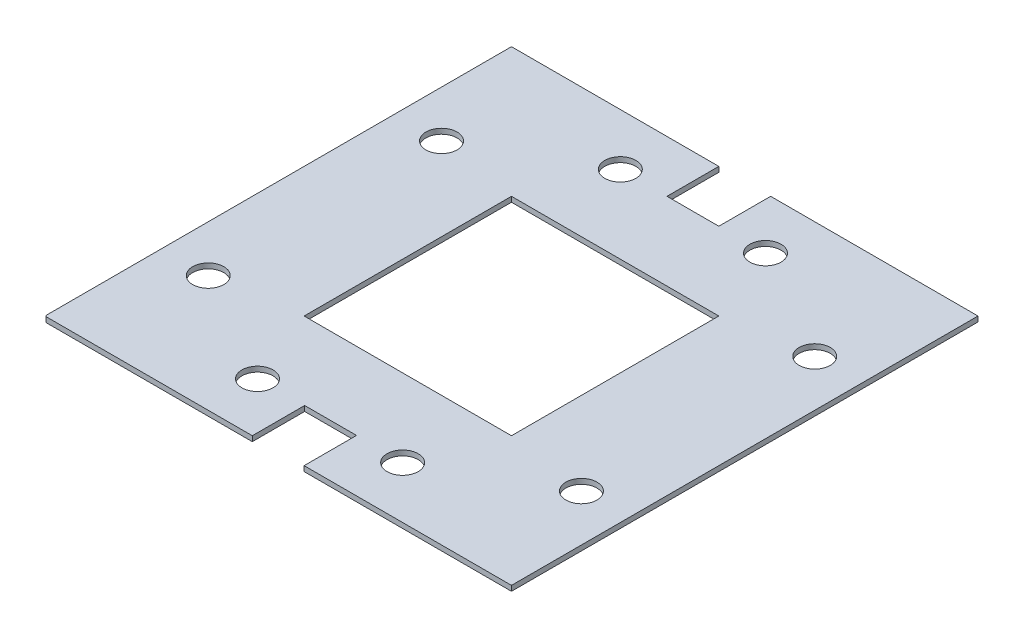
ISO-10303-21;
HEADER;
FILE_DESCRIPTION(('STEP AP214'),'2;1');
FILE_NAME('part.step','',(''),(''),'','','');
FILE_SCHEMA(('AUTOMOTIVE_DESIGN { 1 0 10303 214 1 1 1 1 }'));
ENDSEC;
DATA;
#1=APPLICATION_CONTEXT('core data for automotive mechanical design processes');
#2=APPLICATION_PROTOCOL_DEFINITION('international standard','automotive_design',2000,#1);
#3=PRODUCT_CONTEXT('',#1,'mechanical');
#4=PRODUCT('Part','Part','',(#3));
#5=PRODUCT_RELATED_PRODUCT_CATEGORY('part','',(#4));
#6=PRODUCT_DEFINITION_FORMATION('','',#4);
#7=PRODUCT_DEFINITION_CONTEXT('part definition',#1,'design');
#8=PRODUCT_DEFINITION('design','',#6,#7);
#9=PRODUCT_DEFINITION_SHAPE('','',#8);
#10=(LENGTH_UNIT() NAMED_UNIT(*) SI_UNIT(.MILLI.,.METRE.));
#11=(NAMED_UNIT(*) PLANE_ANGLE_UNIT() SI_UNIT($,.RADIAN.));
#12=(NAMED_UNIT(*) SI_UNIT($,.STERADIAN.) SOLID_ANGLE_UNIT());
#13=UNCERTAINTY_MEASURE_WITH_UNIT(LENGTH_MEASURE(1.E-05),#10,'distance_accuracy_value','');
#14=(GEOMETRIC_REPRESENTATION_CONTEXT(3) GLOBAL_UNCERTAINTY_ASSIGNED_CONTEXT((#13)) GLOBAL_UNIT_ASSIGNED_CONTEXT((#10,
#11,#12)) REPRESENTATION_CONTEXT('',''));
#15=CARTESIAN_POINT('',(0.,0.,0.));
#16=DIRECTION('',(0.,0.,1.));
#17=DIRECTION('',(1.,0.,0.));
#18=AXIS2_PLACEMENT_3D('',#15,#16,#17);
#19=CARTESIAN_POINT('',(0.,0.5,12.5));
#20=DIRECTION('',(0.,0.,-1.));
#21=DIRECTION('',(-1.,0.,0.));
#22=AXIS2_PLACEMENT_3D('',#19,#20,#21);
#23=PLANE('',#22);
#24=DIRECTION('',(1.,0.,0.));
#25=VECTOR('',#24,1.);
#26=CARTESIAN_POINT('',(0.,0.,12.5));
#27=LINE('',#26,#25);
#28=CARTESIAN_POINT('',(-12.3984531823095,0.,12.5));
#29=VERTEX_POINT('',#28);
#30=CARTESIAN_POINT('',(7.49999999999999,0.,12.5));
#31=VERTEX_POINT('',#30);
#32=EDGE_CURVE('E290',#29,#31,#27,.T.);
#33=ORIENTED_EDGE('',*,*,#32,.T.);
#34=DIRECTION('',(0.,1.,0.));
#35=VECTOR('',#34,1.);
#36=CARTESIAN_POINT('',(7.49999999999999,-9.5,12.5));
#37=LINE('',#36,#35);
#38=CARTESIAN_POINT('',(7.49999999999999,0.5,12.5));
#39=VERTEX_POINT('',#38);
#40=EDGE_CURVE('E191',#31,#39,#37,.T.);
#41=ORIENTED_EDGE('',*,*,#40,.T.);
#42=DIRECTION('',(1.,0.,0.));
#43=VECTOR('',#42,1.);
#44=CARTESIAN_POINT('',(0.,0.5,12.5));
#45=LINE('',#44,#43);
#46=CARTESIAN_POINT('',(-12.3984531823095,0.5,12.5));
#47=VERTEX_POINT('',#46);
#48=EDGE_CURVE('E238',#47,#39,#45,.T.);
#49=ORIENTED_EDGE('',*,*,#48,.F.);
#50=DIRECTION('',(0.,-1.,0.));
#51=VECTOR('',#50,1.);
#52=CARTESIAN_POINT('',(-12.3984531823095,0.5,12.5));
#53=LINE('',#52,#51);
#54=EDGE_CURVE('E311',#47,#29,#53,.T.);
#55=ORIENTED_EDGE('',*,*,#54,.T.);
#56=EDGE_LOOP('',(#33,#41,#49,#55));
#57=FACE_BOUND('',#56,.T.);
#58=ADVANCED_FACE('F34',(#57),#23,.F.);
#59=CARTESIAN_POINT('',(0.,0.5,-32.5));
#60=DIRECTION('',(0.,0.,-1.));
#61=DIRECTION('',(-1.,0.,0.));
#62=AXIS2_PLACEMENT_3D('',#59,#60,#61);
#63=PLANE('',#62);
#64=DIRECTION('',(0.,1.,0.));
#65=VECTOR('',#64,1.);
#66=CARTESIAN_POINT('',(7.5,-9.5,-32.5));
#67=LINE('',#66,#65);
#68=CARTESIAN_POINT('',(7.5,0.,-32.5));
#69=VERTEX_POINT('',#68);
#70=CARTESIAN_POINT('',(7.5,0.5,-32.5));
#71=VERTEX_POINT('',#70);
#72=EDGE_CURVE('E166',#69,#71,#67,.T.);
#73=ORIENTED_EDGE('',*,*,#72,.F.);
#74=DIRECTION('',(1.,0.,0.));
#75=VECTOR('',#74,1.);
#76=CARTESIAN_POINT('',(0.,0.,-32.5));
#77=LINE('',#76,#75);
#78=CARTESIAN_POINT('',(-12.5,0.,-32.5));
#79=VERTEX_POINT('',#78);
#80=EDGE_CURVE('E297',#79,#69,#77,.T.);
#81=ORIENTED_EDGE('',*,*,#80,.F.);
#82=DIRECTION('',(0.,-1.,0.));
#83=VECTOR('',#82,1.);
#84=CARTESIAN_POINT('',(-12.5,0.5,-32.5));
#85=LINE('',#84,#83);
#86=CARTESIAN_POINT('',(-12.5,0.5,-32.5));
#87=VERTEX_POINT('',#86);
#88=EDGE_CURVE('E302',#87,#79,#85,.T.);
#89=ORIENTED_EDGE('',*,*,#88,.F.);
#90=DIRECTION('',(1.,0.,0.));
#91=VECTOR('',#90,1.);
#92=CARTESIAN_POINT('',(0.,0.5,-32.5));
#93=LINE('',#92,#91);
#94=EDGE_CURVE('E245',#87,#71,#93,.T.);
#95=ORIENTED_EDGE('',*,*,#94,.T.);
#96=EDGE_LOOP('',(#73,#81,#89,#95));
#97=FACE_BOUND('',#96,.T.);
#98=ADVANCED_FACE('F371',(#97),#63,.T.);
#99=CARTESIAN_POINT('',(-12.5,0.5,0.));
#100=DIRECTION('',(-1.,0.,0.));
#101=DIRECTION('',(0.,0.,1.));
#102=AXIS2_PLACEMENT_3D('',#99,#100,#101);
#103=PLANE('',#102);
#104=DIRECTION('',(0.,0.,-1.));
#105=VECTOR('',#104,1.);
#106=CARTESIAN_POINT('',(-12.5,0.,0.));
#107=LINE('',#106,#105);
#108=CARTESIAN_POINT('',(-12.5,0.,12.3984531823095));
#109=VERTEX_POINT('',#108);
#110=EDGE_CURVE('E283',#109,#79,#107,.T.);
#111=ORIENTED_EDGE('',*,*,#110,.F.);
#112=DIRECTION('',(0.,-1.,0.));
#113=VECTOR('',#112,1.);
#114=CARTESIAN_POINT('',(-12.5,0.5,12.3984531823095));
#115=LINE('',#114,#113);
#116=CARTESIAN_POINT('',(-12.5,0.5,12.3984531823095));
#117=VERTEX_POINT('',#116);
#118=EDGE_CURVE('E314',#117,#109,#115,.T.);
#119=ORIENTED_EDGE('',*,*,#118,.F.);
#120=DIRECTION('',(0.,0.,-1.));
#121=VECTOR('',#120,1.);
#122=CARTESIAN_POINT('',(-12.5,0.5,0.));
#123=LINE('',#122,#121);
#124=EDGE_CURVE('E231',#117,#87,#123,.T.);
#125=ORIENTED_EDGE('',*,*,#124,.T.);
#126=ORIENTED_EDGE('',*,*,#88,.T.);
#127=EDGE_LOOP('',(#111,#119,#125,#126));
#128=FACE_BOUND('',#127,.T.);
#129=ADVANCED_FACE('F368',(#128),#103,.T.);
#130=CARTESIAN_POINT('',(-9.97487373415266,0.5,9.97487373415275));
#131=DIRECTION('',(0.,-1.,0.));
#132=DIRECTION('',(0.,0.,-1.));
#133=AXIS2_PLACEMENT_3D('',#130,#131,#132);
#134=CYLINDRICAL_SURFACE('',#133,3.5);
#135=CARTESIAN_POINT('',(-9.97487373415266,0.,9.97487373415275));
#136=DIRECTION('',(0.,1.,0.));
#137=DIRECTION('',(0.,0.,1.));
#138=AXIS2_PLACEMENT_3D('',#135,#136,#137);
#139=CIRCLE('',#138,3.5);
#140=EDGE_CURVE('E286',#109,#29,#139,.T.);
#141=ORIENTED_EDGE('',*,*,#140,.T.);
#142=ORIENTED_EDGE('',*,*,#54,.F.);
#143=CARTESIAN_POINT('',(-9.97487373415266,0.5,9.97487373415275));
#144=DIRECTION('',(0.,1.,0.));
#145=DIRECTION('',(0.,0.,1.));
#146=AXIS2_PLACEMENT_3D('',#143,#144,#145);
#147=CIRCLE('',#146,3.5);
#148=EDGE_CURVE('E234',#117,#47,#147,.T.);
#149=ORIENTED_EDGE('',*,*,#148,.F.);
#150=ORIENTED_EDGE('',*,*,#118,.T.);
#151=EDGE_LOOP('',(#141,#142,#149,#150));
#152=FACE_BOUND('',#151,.T.);
#153=ADVANCED_FACE('F364',(#152),#134,.T.);
#154=CARTESIAN_POINT('',(12.5,0.5,12.5));
#155=VERTEX_POINT('',#154);
#156=CARTESIAN_POINT('',(32.5,0.5,12.5));
#157=VERTEX_POINT('',#156);
#158=EDGE_CURVE('E237',#155,#157,#45,.T.);
#159=ORIENTED_EDGE('',*,*,#158,.F.);
#160=DIRECTION('',(0.,1.,0.));
#161=VECTOR('',#160,1.);
#162=CARTESIAN_POINT('',(12.5,-9.5,12.5));
#163=LINE('',#162,#161);
#164=CARTESIAN_POINT('',(12.5,0.,12.5));
#165=VERTEX_POINT('',#164);
#166=EDGE_CURVE('E194',#165,#155,#163,.T.);
#167=ORIENTED_EDGE('',*,*,#166,.F.);
#168=CARTESIAN_POINT('',(32.5,0.,12.5));
#169=VERTEX_POINT('',#168);
#170=EDGE_CURVE('E289',#165,#169,#27,.T.);
#171=ORIENTED_EDGE('',*,*,#170,.T.);
#172=DIRECTION('',(0.,-1.,0.));
#173=VECTOR('',#172,1.);
#174=CARTESIAN_POINT('',(32.5,0.5,12.5));
#175=LINE('',#174,#173);
#176=EDGE_CURVE('E308',#157,#169,#175,.T.);
#177=ORIENTED_EDGE('',*,*,#176,.F.);
#178=EDGE_LOOP('',(#159,#167,#171,#177));
#179=FACE_BOUND('',#178,.T.);
#180=ADVANCED_FACE('F350',(#179),#23,.F.);
#181=CARTESIAN_POINT('',(32.5,0.5,0.));
#182=DIRECTION('',(-1.,0.,0.));
#183=DIRECTION('',(0.,0.,1.));
#184=AXIS2_PLACEMENT_3D('',#181,#182,#183);
#185=PLANE('',#184);
#186=DIRECTION('',(0.,0.,-1.));
#187=VECTOR('',#186,1.);
#188=CARTESIAN_POINT('',(32.5,0.,0.));
#189=LINE('',#188,#187);
#190=CARTESIAN_POINT('',(32.5,0.,-32.5));
#191=VERTEX_POINT('',#190);
#192=EDGE_CURVE('E293',#169,#191,#189,.T.);
#193=ORIENTED_EDGE('',*,*,#192,.T.);
#194=DIRECTION('',(0.,-1.,0.));
#195=VECTOR('',#194,1.);
#196=CARTESIAN_POINT('',(32.5,0.5,-32.5));
#197=LINE('',#196,#195);
#198=CARTESIAN_POINT('',(32.5,0.5,-32.5));
#199=VERTEX_POINT('',#198);
#200=EDGE_CURVE('E304',#199,#191,#197,.T.);
#201=ORIENTED_EDGE('',*,*,#200,.F.);
#202=DIRECTION('',(0.,0.,-1.));
#203=VECTOR('',#202,1.);
#204=CARTESIAN_POINT('',(32.5,0.5,0.));
#205=LINE('',#204,#203);
#206=EDGE_CURVE('E241',#157,#199,#205,.T.);
#207=ORIENTED_EDGE('',*,*,#206,.F.);
#208=ORIENTED_EDGE('',*,*,#176,.T.);
#209=EDGE_LOOP('',(#193,#201,#207,#208));
#210=FACE_BOUND('',#209,.T.);
#211=ADVANCED_FACE('F344',(#210),#185,.F.);
#212=CARTESIAN_POINT('',(20.,0.5,0.));
#213=DIRECTION('',(-1.,0.,0.));
#214=DIRECTION('',(0.,0.,1.));
#215=AXIS2_PLACEMENT_3D('',#212,#213,#214);
#216=PLANE('',#215);
#217=DIRECTION('',(0.,0.,-1.));
#218=VECTOR('',#217,1.);
#219=CARTESIAN_POINT('',(20.,0.,0.));
#220=LINE('',#219,#218);
#221=CARTESIAN_POINT('',(20.,0.,0.));
#222=VERTEX_POINT('',#221);
#223=CARTESIAN_POINT('',(20.,0.,-20.));
#224=VERTEX_POINT('',#223);
#225=EDGE_CURVE('E268',#222,#224,#220,.T.);
#226=ORIENTED_EDGE('',*,*,#225,.F.);
#227=DIRECTION('',(0.,-1.,0.));
#228=VECTOR('',#227,1.);
#229=CARTESIAN_POINT('',(20.,0.5,0.));
#230=LINE('',#229,#228);
#231=CARTESIAN_POINT('',(20.,0.5,0.));
#232=VERTEX_POINT('',#231);
#233=EDGE_CURVE('E305',#232,#222,#230,.T.);
#234=ORIENTED_EDGE('',*,*,#233,.F.);
#235=DIRECTION('',(0.,0.,-1.));
#236=VECTOR('',#235,1.);
#237=CARTESIAN_POINT('',(20.,0.5,0.));
#238=LINE('',#237,#236);
#239=CARTESIAN_POINT('',(20.,0.5,-20.));
#240=VERTEX_POINT('',#239);
#241=EDGE_CURVE('E217',#232,#240,#238,.T.);
#242=ORIENTED_EDGE('',*,*,#241,.T.);
#243=DIRECTION('',(0.,-1.,0.));
#244=VECTOR('',#243,1.);
#245=CARTESIAN_POINT('',(20.,0.5,-20.));
#246=LINE('',#245,#244);
#247=EDGE_CURVE('E250',#240,#224,#246,.T.);
#248=ORIENTED_EDGE('',*,*,#247,.T.);
#249=EDGE_LOOP('',(#226,#234,#242,#248));
#250=FACE_BOUND('',#249,.T.);
#251=ADVANCED_FACE('F398',(#250),#216,.T.);
#252=CARTESIAN_POINT('',(0.,0.5,0.));
#253=DIRECTION('',(0.,0.,-1.));
#254=DIRECTION('',(-1.,0.,0.));
#255=AXIS2_PLACEMENT_3D('',#252,#253,#254);
#256=PLANE('',#255);
#257=DIRECTION('',(1.,0.,0.));
#258=VECTOR('',#257,1.);
#259=CARTESIAN_POINT('',(0.,0.,0.));
#260=LINE('',#259,#258);
#261=CARTESIAN_POINT('',(0.,0.,0.));
#262=VERTEX_POINT('',#261);
#263=EDGE_CURVE('E271',#262,#222,#260,.T.);
#264=ORIENTED_EDGE('',*,*,#263,.F.);
#265=DIRECTION('',(0.,-1.,0.));
#266=VECTOR('',#265,1.);
#267=CARTESIAN_POINT('',(0.,0.5,0.));
#268=LINE('',#267,#266);
#269=CARTESIAN_POINT('',(0.,0.5,0.));
#270=VERTEX_POINT('',#269);
#271=EDGE_CURVE('E321',#270,#262,#268,.T.);
#272=ORIENTED_EDGE('',*,*,#271,.F.);
#273=DIRECTION('',(1.,0.,0.));
#274=VECTOR('',#273,1.);
#275=CARTESIAN_POINT('',(0.,0.5,0.));
#276=LINE('',#275,#274);
#277=EDGE_CURVE('E220',#270,#232,#276,.T.);
#278=ORIENTED_EDGE('',*,*,#277,.T.);
#279=ORIENTED_EDGE('',*,*,#233,.T.);
#280=EDGE_LOOP('',(#264,#272,#278,#279));
#281=FACE_BOUND('',#280,.T.);
#282=ADVANCED_FACE('F392',(#281),#256,.T.);
#283=CARTESIAN_POINT('',(0.,0.5,0.));
#284=DIRECTION('',(-1.,0.,0.));
#285=DIRECTION('',(0.,0.,1.));
#286=AXIS2_PLACEMENT_3D('',#283,#284,#285);
#287=PLANE('',#286);
#288=DIRECTION('',(0.,0.,-1.));
#289=VECTOR('',#288,1.);
#290=CARTESIAN_POINT('',(0.,0.,0.));
#291=LINE('',#290,#289);
#292=CARTESIAN_POINT('',(0.,0.,-20.));
#293=VERTEX_POINT('',#292);
#294=EDGE_CURVE('E274',#262,#293,#291,.T.);
#295=ORIENTED_EDGE('',*,*,#294,.T.);
#296=DIRECTION('',(0.,-1.,0.));
#297=VECTOR('',#296,1.);
#298=CARTESIAN_POINT('',(0.,0.5,-20.));
#299=LINE('',#298,#297);
#300=CARTESIAN_POINT('',(0.,0.5,-20.));
#301=VERTEX_POINT('',#300);
#302=EDGE_CURVE('E318',#301,#293,#299,.T.);
#303=ORIENTED_EDGE('',*,*,#302,.F.);
#304=DIRECTION('',(0.,0.,-1.));
#305=VECTOR('',#304,1.);
#306=CARTESIAN_POINT('',(0.,0.5,0.));
#307=LINE('',#306,#305);
#308=EDGE_CURVE('E223',#270,#301,#307,.T.);
#309=ORIENTED_EDGE('',*,*,#308,.F.);
#310=ORIENTED_EDGE('',*,*,#271,.T.);
#311=EDGE_LOOP('',(#295,#303,#309,#310));
#312=FACE_BOUND('',#311,.T.);
#313=ADVANCED_FACE('F384',(#312),#287,.F.);
#314=DIRECTION('',(0.,1.,0.));
#315=VECTOR('',#314,1.);
#316=CARTESIAN_POINT('',(12.5,-9.5,-32.5));
#317=LINE('',#316,#315);
#318=CARTESIAN_POINT('',(12.5,0.,-32.5));
#319=VERTEX_POINT('',#318);
#320=CARTESIAN_POINT('',(12.5,0.5,-32.5));
#321=VERTEX_POINT('',#320);
#322=EDGE_CURVE('E180',#319,#321,#317,.T.);
#323=ORIENTED_EDGE('',*,*,#322,.T.);
#324=EDGE_CURVE('E244',#321,#199,#93,.T.);
#325=ORIENTED_EDGE('',*,*,#324,.T.);
#326=ORIENTED_EDGE('',*,*,#200,.T.);
#327=EDGE_CURVE('E296',#319,#191,#77,.T.);
#328=ORIENTED_EDGE('',*,*,#327,.F.);
#329=EDGE_LOOP('',(#323,#325,#326,#328));
#330=FACE_BOUND('',#329,.T.);
#331=ADVANCED_FACE('F340',(#330),#63,.T.);
#332=CARTESIAN_POINT('',(-8.,0.5,1.25));
#333=DIRECTION('',(0.,-1.,0.));
#334=DIRECTION('',(0.,0.,-1.));
#335=AXIS2_PLACEMENT_3D('',#332,#333,#334);
#336=CYLINDRICAL_SURFACE('',#335,1.5);
#337=CARTESIAN_POINT('',(-8.,0.5,1.25));
#338=DIRECTION('',(0.,1.,0.));
#339=DIRECTION('',(0.,0.,1.));
#340=AXIS2_PLACEMENT_3D('',#337,#338,#339);
#341=CIRCLE('',#340,1.5);
#342=CARTESIAN_POINT('',(-8.,0.5,2.75));
#343=VERTEX_POINT('',#342);
#344=EDGE_CURVE('E228',#343,#343,#341,.F.);
#345=ORIENTED_EDGE('',*,*,#344,.F.);
#346=EDGE_LOOP('',(#345));
#347=FACE_BOUND('',#346,.T.);
#348=CARTESIAN_POINT('',(-8.,0.,1.25));
#349=DIRECTION('',(0.,1.,0.));
#350=DIRECTION('',(0.,0.,1.));
#351=AXIS2_PLACEMENT_3D('',#348,#349,#350);
#352=CIRCLE('',#351,1.5);
#353=CARTESIAN_POINT('',(-8.,0.,2.75));
#354=VERTEX_POINT('',#353);
#355=EDGE_CURVE('E280',#354,#354,#352,.F.);
#356=ORIENTED_EDGE('',*,*,#355,.T.);
#357=EDGE_LOOP('',(#356));
#358=FACE_BOUND('',#357,.T.);
#359=ADVANCED_FACE('F383',(#347,#358),#336,.F.);
#360=CARTESIAN_POINT('',(0.,0.5,-20.));
#361=DIRECTION('',(0.,0.,-1.));
#362=DIRECTION('',(-1.,0.,0.));
#363=AXIS2_PLACEMENT_3D('',#360,#361,#362);
#364=PLANE('',#363);
#365=DIRECTION('',(1.,0.,0.));
#366=VECTOR('',#365,1.);
#367=CARTESIAN_POINT('',(0.,0.,-20.));
#368=LINE('',#367,#366);
#369=EDGE_CURVE('E277',#293,#224,#368,.T.);
#370=ORIENTED_EDGE('',*,*,#369,.T.);
#371=ORIENTED_EDGE('',*,*,#247,.F.);
#372=DIRECTION('',(1.,0.,0.));
#373=VECTOR('',#372,1.);
#374=CARTESIAN_POINT('',(0.,0.5,-20.));
#375=LINE('',#374,#373);
#376=EDGE_CURVE('E226',#301,#240,#375,.T.);
#377=ORIENTED_EDGE('',*,*,#376,.F.);
#378=ORIENTED_EDGE('',*,*,#302,.T.);
#379=EDGE_LOOP('',(#370,#371,#377,#378));
#380=FACE_BOUND('',#379,.T.);
#381=ADVANCED_FACE('F389',(#380),#364,.F.);
#382=CARTESIAN_POINT('',(-8.,0.5,-21.25));
#383=DIRECTION('',(0.,-1.,0.));
#384=DIRECTION('',(0.,0.,-1.));
#385=AXIS2_PLACEMENT_3D('',#382,#383,#384);
#386=CYLINDRICAL_SURFACE('',#385,1.5);
#387=CARTESIAN_POINT('',(-8.,0.5,-21.25));
#388=DIRECTION('',(0.,1.,0.));
#389=DIRECTION('',(0.,0.,1.));
#390=AXIS2_PLACEMENT_3D('',#387,#388,#389);
#391=CIRCLE('',#390,1.5);
#392=CARTESIAN_POINT('',(-8.,0.5,-19.75));
#393=VERTEX_POINT('',#392);
#394=EDGE_CURVE('E214',#393,#393,#391,.F.);
#395=ORIENTED_EDGE('',*,*,#394,.F.);
#396=EDGE_LOOP('',(#395));
#397=FACE_BOUND('',#396,.T.);
#398=CARTESIAN_POINT('',(-8.,0.,-21.25));
#399=DIRECTION('',(0.,1.,0.));
#400=DIRECTION('',(0.,0.,1.));
#401=AXIS2_PLACEMENT_3D('',#398,#399,#400);
#402=CIRCLE('',#401,1.5);
#403=CARTESIAN_POINT('',(-8.,0.,-19.75));
#404=VERTEX_POINT('',#403);
#405=EDGE_CURVE('E265',#404,#404,#402,.F.);
#406=ORIENTED_EDGE('',*,*,#405,.T.);
#407=EDGE_LOOP('',(#406));
#408=FACE_BOUND('',#407,.T.);
#409=ADVANCED_FACE('F406',(#397,#408),#386,.F.);
#410=CARTESIAN_POINT('',(3.,0.5,-27.5));
#411=DIRECTION('',(0.,-1.,0.));
#412=DIRECTION('',(0.,0.,-1.));
#413=AXIS2_PLACEMENT_3D('',#410,#411,#412);
#414=CYLINDRICAL_SURFACE('',#413,1.5);
#415=CARTESIAN_POINT('',(3.,0.5,-27.5));
#416=DIRECTION('',(0.,1.,0.));
#417=DIRECTION('',(0.,0.,1.));
#418=AXIS2_PLACEMENT_3D('',#415,#416,#417);
#419=CIRCLE('',#418,1.5);
#420=CARTESIAN_POINT('',(3.,0.5,-26.));
#421=VERTEX_POINT('',#420);
#422=EDGE_CURVE('E211',#421,#421,#419,.T.);
#423=ORIENTED_EDGE('',*,*,#422,.T.);
#424=EDGE_LOOP('',(#423));
#425=FACE_BOUND('',#424,.T.);
#426=CARTESIAN_POINT('',(3.,0.,-27.5));
#427=DIRECTION('',(0.,1.,0.));
#428=DIRECTION('',(0.,0.,1.));
#429=AXIS2_PLACEMENT_3D('',#426,#427,#428);
#430=CIRCLE('',#429,1.5);
#431=CARTESIAN_POINT('',(3.,0.,-26.));
#432=VERTEX_POINT('',#431);
#433=EDGE_CURVE('E262',#432,#432,#430,.T.);
#434=ORIENTED_EDGE('',*,*,#433,.F.);
#435=EDGE_LOOP('',(#434));
#436=FACE_BOUND('',#435,.T.);
#437=ADVANCED_FACE('F409',(#425,#436),#414,.F.);
#438=CARTESIAN_POINT('',(17.,0.5,-27.5));
#439=DIRECTION('',(0.,-1.,0.));
#440=DIRECTION('',(0.,0.,-1.));
#441=AXIS2_PLACEMENT_3D('',#438,#439,#440);
#442=CYLINDRICAL_SURFACE('',#441,1.5);
#443=CARTESIAN_POINT('',(17.,0.5,-27.5));
#444=DIRECTION('',(0.,1.,0.));
#445=DIRECTION('',(0.,0.,1.));
#446=AXIS2_PLACEMENT_3D('',#443,#444,#445);
#447=CIRCLE('',#446,1.5);
#448=CARTESIAN_POINT('',(17.,0.5,-26.));
#449=VERTEX_POINT('',#448);
#450=EDGE_CURVE('E208',#449,#449,#447,.T.);
#451=ORIENTED_EDGE('',*,*,#450,.T.);
#452=EDGE_LOOP('',(#451));
#453=FACE_BOUND('',#452,.T.);
#454=CARTESIAN_POINT('',(17.,0.,-27.5));
#455=DIRECTION('',(0.,1.,0.));
#456=DIRECTION('',(0.,0.,1.));
#457=AXIS2_PLACEMENT_3D('',#454,#455,#456);
#458=CIRCLE('',#457,1.5);
#459=CARTESIAN_POINT('',(17.,0.,-26.));
#460=VERTEX_POINT('',#459);
#461=EDGE_CURVE('E259',#460,#460,#458,.T.);
#462=ORIENTED_EDGE('',*,*,#461,.F.);
#463=EDGE_LOOP('',(#462));
#464=FACE_BOUND('',#463,.T.);
#465=ADVANCED_FACE('F413',(#453,#464),#442,.F.);
#466=CARTESIAN_POINT('',(17.,0.5,7.5));
#467=DIRECTION('',(0.,-1.,0.));
#468=DIRECTION('',(0.,0.,-1.));
#469=AXIS2_PLACEMENT_3D('',#466,#467,#468);
#470=CYLINDRICAL_SURFACE('',#469,1.5);
#471=CARTESIAN_POINT('',(17.,0.5,7.5));
#472=DIRECTION('',(0.,1.,0.));
#473=DIRECTION('',(0.,0.,1.));
#474=AXIS2_PLACEMENT_3D('',#471,#472,#473);
#475=CIRCLE('',#474,1.5);
#476=CARTESIAN_POINT('',(17.,0.5,9.));
#477=VERTEX_POINT('',#476);
#478=EDGE_CURVE('E205',#477,#477,#475,.F.);
#479=ORIENTED_EDGE('',*,*,#478,.F.);
#480=EDGE_LOOP('',(#479));
#481=FACE_BOUND('',#480,.T.);
#482=CARTESIAN_POINT('',(17.,0.,7.5));
#483=DIRECTION('',(0.,1.,0.));
#484=DIRECTION('',(0.,0.,1.));
#485=AXIS2_PLACEMENT_3D('',#482,#483,#484);
#486=CIRCLE('',#485,1.5);
#487=CARTESIAN_POINT('',(17.,0.,9.));
#488=VERTEX_POINT('',#487);
#489=EDGE_CURVE('E256',#488,#488,#486,.F.);
#490=ORIENTED_EDGE('',*,*,#489,.T.);
#491=EDGE_LOOP('',(#490));
#492=FACE_BOUND('',#491,.T.);
#493=ADVANCED_FACE('F417',(#481,#492),#470,.F.);
#494=CARTESIAN_POINT('',(28.,0.5,-21.25));
#495=DIRECTION('',(0.,-1.,0.));
#496=DIRECTION('',(0.,0.,-1.));
#497=AXIS2_PLACEMENT_3D('',#494,#495,#496);
#498=CYLINDRICAL_SURFACE('',#497,1.5);
#499=CARTESIAN_POINT('',(28.,0.5,-21.25));
#500=DIRECTION('',(0.,1.,0.));
#501=DIRECTION('',(0.,0.,1.));
#502=AXIS2_PLACEMENT_3D('',#499,#500,#501);
#503=CIRCLE('',#502,1.5);
#504=CARTESIAN_POINT('',(28.,0.5,-19.75));
#505=VERTEX_POINT('',#504);
#506=EDGE_CURVE('E201',#505,#505,#503,.T.);
#507=ORIENTED_EDGE('',*,*,#506,.T.);
#508=EDGE_LOOP('',(#507));
#509=FACE_BOUND('',#508,.T.);
#510=CARTESIAN_POINT('',(28.,0.,-21.25));
#511=DIRECTION('',(0.,1.,0.));
#512=DIRECTION('',(0.,0.,1.));
#513=AXIS2_PLACEMENT_3D('',#510,#511,#512);
#514=CIRCLE('',#513,1.5);
#515=CARTESIAN_POINT('',(28.,0.,-19.75));
#516=VERTEX_POINT('',#515);
#517=EDGE_CURVE('E253',#516,#516,#514,.T.);
#518=ORIENTED_EDGE('',*,*,#517,.F.);
#519=EDGE_LOOP('',(#518));
#520=FACE_BOUND('',#519,.T.);
#521=ADVANCED_FACE('F420',(#509,#520),#498,.F.);
#522=CARTESIAN_POINT('',(28.,0.5,1.25));
#523=DIRECTION('',(0.,-1.,0.));
#524=DIRECTION('',(0.,0.,-1.));
#525=AXIS2_PLACEMENT_3D('',#522,#523,#524);
#526=CYLINDRICAL_SURFACE('',#525,1.5);
#527=CARTESIAN_POINT('',(28.,0.5,1.25));
#528=DIRECTION('',(0.,1.,0.));
#529=DIRECTION('',(0.,0.,1.));
#530=AXIS2_PLACEMENT_3D('',#527,#528,#529);
#531=CIRCLE('',#530,1.5);
#532=CARTESIAN_POINT('',(28.,0.5,2.75));
#533=VERTEX_POINT('',#532);
#534=EDGE_CURVE('E198',#533,#533,#531,.T.);
#535=ORIENTED_EDGE('',*,*,#534,.T.);
#536=EDGE_LOOP('',(#535));
#537=FACE_BOUND('',#536,.T.);
#538=CARTESIAN_POINT('',(28.,0.,1.25));
#539=DIRECTION('',(0.,1.,0.));
#540=DIRECTION('',(0.,0.,1.));
#541=AXIS2_PLACEMENT_3D('',#538,#539,#540);
#542=CIRCLE('',#541,1.5);
#543=CARTESIAN_POINT('',(28.,0.,2.75));
#544=VERTEX_POINT('',#543);
#545=EDGE_CURVE('E179',#544,#544,#542,.T.);
#546=ORIENTED_EDGE('',*,*,#545,.F.);
#547=EDGE_LOOP('',(#546));
#548=FACE_BOUND('',#547,.T.);
#549=ADVANCED_FACE('F36',(#537,#548),#526,.F.);
#550=CARTESIAN_POINT('',(3.,0.5,7.5));
#551=DIRECTION('',(0.,-1.,0.));
#552=DIRECTION('',(0.,0.,-1.));
#553=AXIS2_PLACEMENT_3D('',#550,#551,#552);
#554=CYLINDRICAL_SURFACE('',#553,1.5);
#555=CARTESIAN_POINT('',(3.,0.5,7.5));
#556=DIRECTION('',(0.,1.,0.));
#557=DIRECTION('',(0.,0.,1.));
#558=AXIS2_PLACEMENT_3D('',#555,#556,#557);
#559=CIRCLE('',#558,1.5);
#560=CARTESIAN_POINT('',(3.,0.5,9.));
#561=VERTEX_POINT('',#560);
#562=EDGE_CURVE('E247',#561,#561,#559,.F.);
#563=ORIENTED_EDGE('',*,*,#562,.F.);
#564=EDGE_LOOP('',(#563));
#565=FACE_BOUND('',#564,.T.);
#566=CARTESIAN_POINT('',(3.,0.,7.5));
#567=DIRECTION('',(0.,1.,0.));
#568=DIRECTION('',(0.,0.,1.));
#569=AXIS2_PLACEMENT_3D('',#566,#567,#568);
#570=CIRCLE('',#569,1.5);
#571=CARTESIAN_POINT('',(3.,0.,9.));
#572=VERTEX_POINT('',#571);
#573=EDGE_CURVE('E202',#572,#572,#570,.F.);
#574=ORIENTED_EDGE('',*,*,#573,.T.);
#575=EDGE_LOOP('',(#574));
#576=FACE_BOUND('',#575,.T.);
#577=ADVANCED_FACE('F427',(#565,#576),#554,.F.);
#578=CARTESIAN_POINT('',(0.,0.5,0.));
#579=DIRECTION('',(0.,1.,0.));
#580=DIRECTION('',(0.,0.,1.));
#581=AXIS2_PLACEMENT_3D('',#578,#579,#580);
#582=PLANE('',#581);
#583=DIRECTION('',(0.,0.,1.));
#584=VECTOR('',#583,1.);
#585=CARTESIAN_POINT('',(7.5,0.5,-32.5));
#586=LINE('',#585,#584);
#587=CARTESIAN_POINT('',(7.5,0.5,-27.5));
#588=VERTEX_POINT('',#587);
#589=EDGE_CURVE('E163',#71,#588,#586,.T.);
#590=ORIENTED_EDGE('',*,*,#589,.F.);
#591=ORIENTED_EDGE('',*,*,#94,.F.);
#592=ORIENTED_EDGE('',*,*,#124,.F.);
#593=ORIENTED_EDGE('',*,*,#148,.T.);
#594=ORIENTED_EDGE('',*,*,#48,.T.);
#595=DIRECTION('',(0.,0.,1.));
#596=VECTOR('',#595,1.);
#597=CARTESIAN_POINT('',(7.49999999999999,0.5,12.5));
#598=LINE('',#597,#596);
#599=CARTESIAN_POINT('',(7.50000000000001,0.5,7.44922659115475));
#600=VERTEX_POINT('',#599);
#601=EDGE_CURVE('E184',#600,#39,#598,.T.);
#602=ORIENTED_EDGE('',*,*,#601,.F.);
#603=DIRECTION('',(-1.,0.,0.));
#604=VECTOR('',#603,1.);
#605=CARTESIAN_POINT('',(7.50000000000001,0.5,7.44922659115475));
#606=LINE('',#605,#604);
#607=CARTESIAN_POINT('',(12.5,0.5,7.44922659115475));
#608=VERTEX_POINT('',#607);
#609=EDGE_CURVE('E188',#608,#600,#606,.T.);
#610=ORIENTED_EDGE('',*,*,#609,.F.);
#611=DIRECTION('',(0.,0.,-1.));
#612=VECTOR('',#611,1.);
#613=CARTESIAN_POINT('',(12.5,0.5,12.5));
#614=LINE('',#613,#612);
#615=EDGE_CURVE('E186',#155,#608,#614,.T.);
#616=ORIENTED_EDGE('',*,*,#615,.F.);
#617=ORIENTED_EDGE('',*,*,#158,.T.);
#618=ORIENTED_EDGE('',*,*,#206,.T.);
#619=ORIENTED_EDGE('',*,*,#324,.F.);
#620=DIRECTION('',(0.,0.,-1.));
#621=VECTOR('',#620,1.);
#622=CARTESIAN_POINT('',(12.5,0.5,-32.5));
#623=LINE('',#622,#621);
#624=CARTESIAN_POINT('',(12.5,0.5,-27.5));
#625=VERTEX_POINT('',#624);
#626=EDGE_CURVE('E160',#625,#321,#623,.T.);
#627=ORIENTED_EDGE('',*,*,#626,.F.);
#628=DIRECTION('',(1.,0.,0.));
#629=VECTOR('',#628,1.);
#630=CARTESIAN_POINT('',(7.5,0.5,-27.5));
#631=LINE('',#630,#629);
#632=EDGE_CURVE('E155',#588,#625,#631,.T.);
#633=ORIENTED_EDGE('',*,*,#632,.F.);
#634=EDGE_LOOP('',(#590,#591,#592,#593,#594,#602,#610,#616,#617,#618,#619,#627,#633));
#635=FACE_BOUND('',#634,.T.);
#636=ORIENTED_EDGE('',*,*,#534,.F.);
#637=EDGE_LOOP('',(#636));
#638=FACE_BOUND('',#637,.T.);
#639=ORIENTED_EDGE('',*,*,#506,.F.);
#640=EDGE_LOOP('',(#639));
#641=FACE_BOUND('',#640,.T.);
#642=ORIENTED_EDGE('',*,*,#478,.T.);
#643=EDGE_LOOP('',(#642));
#644=FACE_BOUND('',#643,.T.);
#645=ORIENTED_EDGE('',*,*,#450,.F.);
#646=EDGE_LOOP('',(#645));
#647=FACE_BOUND('',#646,.T.);
#648=ORIENTED_EDGE('',*,*,#422,.F.);
#649=EDGE_LOOP('',(#648));
#650=FACE_BOUND('',#649,.T.);
#651=ORIENTED_EDGE('',*,*,#394,.T.);
#652=EDGE_LOOP('',(#651));
#653=FACE_BOUND('',#652,.T.);
#654=ORIENTED_EDGE('',*,*,#241,.F.);
#655=ORIENTED_EDGE('',*,*,#277,.F.);
#656=ORIENTED_EDGE('',*,*,#308,.T.);
#657=ORIENTED_EDGE('',*,*,#376,.T.);
#658=EDGE_LOOP('',(#654,#655,#656,#657));
#659=FACE_BOUND('',#658,.T.);
#660=ORIENTED_EDGE('',*,*,#344,.T.);
#661=EDGE_LOOP('',(#660));
#662=FACE_BOUND('',#661,.T.);
#663=ORIENTED_EDGE('',*,*,#562,.T.);
#664=EDGE_LOOP('',(#663));
#665=FACE_BOUND('',#664,.T.);
#666=ADVANCED_FACE('F172',(#635,#638,#641,#644,#647,#650,#653,#659,#662,#665),#582,.T.);
#667=CARTESIAN_POINT('',(0.,0.,0.));
#668=DIRECTION('',(0.,1.,0.));
#669=DIRECTION('',(0.,0.,1.));
#670=AXIS2_PLACEMENT_3D('',#667,#668,#669);
#671=PLANE('',#670);
#672=ORIENTED_EDGE('',*,*,#80,.T.);
#673=DIRECTION('',(0.,0.,1.));
#674=VECTOR('',#673,1.);
#675=CARTESIAN_POINT('',(7.49999999999999,0.,0.));
#676=LINE('',#675,#674);
#677=CARTESIAN_POINT('',(7.5,0.,-27.5));
#678=VERTEX_POINT('',#677);
#679=EDGE_CURVE('E11',#69,#678,#676,.T.);
#680=ORIENTED_EDGE('',*,*,#679,.T.);
#681=DIRECTION('',(1.,0.,0.));
#682=VECTOR('',#681,1.);
#683=CARTESIAN_POINT('',(0.,0.,-27.5));
#684=LINE('',#683,#682);
#685=CARTESIAN_POINT('',(12.5,0.,-27.5));
#686=VERTEX_POINT('',#685);
#687=EDGE_CURVE('E158',#678,#686,#684,.T.);
#688=ORIENTED_EDGE('',*,*,#687,.T.);
#689=DIRECTION('',(0.,0.,-1.));
#690=VECTOR('',#689,1.);
#691=CARTESIAN_POINT('',(12.5,0.,0.));
#692=LINE('',#691,#690);
#693=EDGE_CURVE('E42',#686,#319,#692,.T.);
#694=ORIENTED_EDGE('',*,*,#693,.T.);
#695=ORIENTED_EDGE('',*,*,#327,.T.);
#696=ORIENTED_EDGE('',*,*,#192,.F.);
#697=ORIENTED_EDGE('',*,*,#170,.F.);
#698=DIRECTION('',(0.,0.,-1.));
#699=VECTOR('',#698,1.);
#700=CARTESIAN_POINT('',(12.5,0.,0.));
#701=LINE('',#700,#699);
#702=CARTESIAN_POINT('',(12.5,0.,7.44922659115475));
#703=VERTEX_POINT('',#702);
#704=EDGE_CURVE('E316',#165,#703,#701,.T.);
#705=ORIENTED_EDGE('',*,*,#704,.T.);
#706=DIRECTION('',(-1.,0.,0.));
#707=VECTOR('',#706,1.);
#708=CARTESIAN_POINT('',(0.,0.,7.44922659115475));
#709=LINE('',#708,#707);
#710=CARTESIAN_POINT('',(7.50000000000001,0.,7.44922659115475));
#711=VERTEX_POINT('',#710);
#712=EDGE_CURVE('E326',#703,#711,#709,.T.);
#713=ORIENTED_EDGE('',*,*,#712,.T.);
#714=DIRECTION('',(0.,0.,1.));
#715=VECTOR('',#714,1.);
#716=CARTESIAN_POINT('',(7.50000000000003,0.,0.));
#717=LINE('',#716,#715);
#718=EDGE_CURVE('E329',#711,#31,#717,.T.);
#719=ORIENTED_EDGE('',*,*,#718,.T.);
#720=ORIENTED_EDGE('',*,*,#32,.F.);
#721=ORIENTED_EDGE('',*,*,#140,.F.);
#722=ORIENTED_EDGE('',*,*,#110,.T.);
#723=EDGE_LOOP('',(#672,#680,#688,#694,#695,#696,#697,#705,#713,#719,#720,#721,#722));
#724=FACE_BOUND('',#723,.T.);
#725=ORIENTED_EDGE('',*,*,#545,.T.);
#726=EDGE_LOOP('',(#725));
#727=FACE_BOUND('',#726,.T.);
#728=ORIENTED_EDGE('',*,*,#517,.T.);
#729=EDGE_LOOP('',(#728));
#730=FACE_BOUND('',#729,.T.);
#731=ORIENTED_EDGE('',*,*,#489,.F.);
#732=EDGE_LOOP('',(#731));
#733=FACE_BOUND('',#732,.T.);
#734=ORIENTED_EDGE('',*,*,#461,.T.);
#735=EDGE_LOOP('',(#734));
#736=FACE_BOUND('',#735,.T.);
#737=ORIENTED_EDGE('',*,*,#433,.T.);
#738=EDGE_LOOP('',(#737));
#739=FACE_BOUND('',#738,.T.);
#740=ORIENTED_EDGE('',*,*,#405,.F.);
#741=EDGE_LOOP('',(#740));
#742=FACE_BOUND('',#741,.T.);
#743=ORIENTED_EDGE('',*,*,#225,.T.);
#744=ORIENTED_EDGE('',*,*,#369,.F.);
#745=ORIENTED_EDGE('',*,*,#294,.F.);
#746=ORIENTED_EDGE('',*,*,#263,.T.);
#747=EDGE_LOOP('',(#743,#744,#745,#746));
#748=FACE_BOUND('',#747,.T.);
#749=ORIENTED_EDGE('',*,*,#355,.F.);
#750=EDGE_LOOP('',(#749));
#751=FACE_BOUND('',#750,.T.);
#752=ORIENTED_EDGE('',*,*,#573,.F.);
#753=EDGE_LOOP('',(#752));
#754=FACE_BOUND('',#753,.T.);
#755=ADVANCED_FACE('F335',(#724,#727,#730,#733,#736,#739,#742,#748,#751,#754),#671,.F.);
#756=CARTESIAN_POINT('',(7.49999999999999,-9.5,12.5));
#757=DIRECTION('',(-1.,0.,0.));
#758=DIRECTION('',(0.,0.,1.));
#759=AXIS2_PLACEMENT_3D('',#756,#757,#758);
#760=PLANE('',#759);
#761=DIRECTION('',(0.,1.,0.));
#762=VECTOR('',#761,1.);
#763=CARTESIAN_POINT('',(7.50000000000001,-9.5,7.44922659115475));
#764=LINE('',#763,#762);
#765=EDGE_CURVE('E170',#711,#600,#764,.T.);
#766=ORIENTED_EDGE('',*,*,#765,.T.);
#767=ORIENTED_EDGE('',*,*,#601,.T.);
#768=ORIENTED_EDGE('',*,*,#40,.F.);
#769=ORIENTED_EDGE('',*,*,#718,.F.);
#770=EDGE_LOOP('',(#766,#767,#768,#769));
#771=FACE_BOUND('',#770,.T.);
#772=ADVANCED_FACE('F435',(#771),#760,.F.);
#773=CARTESIAN_POINT('',(7.50000000000001,-9.5,7.44922659115475));
#774=DIRECTION('',(0.,0.,-1.));
#775=DIRECTION('',(-1.,0.,0.));
#776=AXIS2_PLACEMENT_3D('',#773,#774,#775);
#777=PLANE('',#776);
#778=DIRECTION('',(0.,1.,0.));
#779=VECTOR('',#778,1.);
#780=CARTESIAN_POINT('',(12.5,-9.5,7.44922659115475));
#781=LINE('',#780,#779);
#782=EDGE_CURVE('E57',#703,#608,#781,.T.);
#783=ORIENTED_EDGE('',*,*,#782,.T.);
#784=ORIENTED_EDGE('',*,*,#609,.T.);
#785=ORIENTED_EDGE('',*,*,#765,.F.);
#786=ORIENTED_EDGE('',*,*,#712,.F.);
#787=EDGE_LOOP('',(#783,#784,#785,#786));
#788=FACE_BOUND('',#787,.T.);
#789=ADVANCED_FACE('F357',(#788),#777,.F.);
#790=CARTESIAN_POINT('',(12.5,-9.5,12.5));
#791=DIRECTION('',(1.,0.,0.));
#792=DIRECTION('',(0.,0.,-1.));
#793=AXIS2_PLACEMENT_3D('',#790,#791,#792);
#794=PLANE('',#793);
#795=ORIENTED_EDGE('',*,*,#166,.T.);
#796=ORIENTED_EDGE('',*,*,#615,.T.);
#797=ORIENTED_EDGE('',*,*,#782,.F.);
#798=ORIENTED_EDGE('',*,*,#704,.F.);
#799=EDGE_LOOP('',(#795,#796,#797,#798));
#800=FACE_BOUND('',#799,.T.);
#801=ADVANCED_FACE('F352',(#800),#794,.F.);
#802=CARTESIAN_POINT('',(7.5,-9.5,-32.5));
#803=DIRECTION('',(-1.,0.,0.));
#804=DIRECTION('',(0.,0.,1.));
#805=AXIS2_PLACEMENT_3D('',#802,#803,#804);
#806=PLANE('',#805);
#807=ORIENTED_EDGE('',*,*,#72,.T.);
#808=ORIENTED_EDGE('',*,*,#589,.T.);
#809=DIRECTION('',(0.,1.,0.));
#810=VECTOR('',#809,1.);
#811=CARTESIAN_POINT('',(7.5,-9.5,-27.5));
#812=LINE('',#811,#810);
#813=EDGE_CURVE('E151',#678,#588,#812,.T.);
#814=ORIENTED_EDGE('',*,*,#813,.F.);
#815=ORIENTED_EDGE('',*,*,#679,.F.);
#816=EDGE_LOOP('',(#807,#808,#814,#815));
#817=FACE_BOUND('',#816,.T.);
#818=ADVANCED_FACE('F164',(#817),#806,.F.);
#819=CARTESIAN_POINT('',(12.5,-9.5,-32.5));
#820=DIRECTION('',(1.,0.,0.));
#821=DIRECTION('',(0.,0.,-1.));
#822=AXIS2_PLACEMENT_3D('',#819,#820,#821);
#823=PLANE('',#822);
#824=DIRECTION('',(0.,1.,0.));
#825=VECTOR('',#824,1.);
#826=CARTESIAN_POINT('',(12.5,-9.5,-27.5));
#827=LINE('',#826,#825);
#828=EDGE_CURVE('E49',#686,#625,#827,.T.);
#829=ORIENTED_EDGE('',*,*,#828,.T.);
#830=ORIENTED_EDGE('',*,*,#626,.T.);
#831=ORIENTED_EDGE('',*,*,#322,.F.);
#832=ORIENTED_EDGE('',*,*,#693,.F.);
#833=EDGE_LOOP('',(#829,#830,#831,#832));
#834=FACE_BOUND('',#833,.T.);
#835=ADVANCED_FACE('F467',(#834),#823,.F.);
#836=CARTESIAN_POINT('',(7.5,-9.5,-27.5));
#837=DIRECTION('',(0.,0.,1.));
#838=DIRECTION('',(1.,0.,0.));
#839=AXIS2_PLACEMENT_3D('',#836,#837,#838);
#840=PLANE('',#839);
#841=ORIENTED_EDGE('',*,*,#813,.T.);
#842=ORIENTED_EDGE('',*,*,#632,.T.);
#843=ORIENTED_EDGE('',*,*,#828,.F.);
#844=ORIENTED_EDGE('',*,*,#687,.F.);
#845=EDGE_LOOP('',(#841,#842,#843,#844));
#846=FACE_BOUND('',#845,.T.);
#847=ADVANCED_FACE('F153',(#846),#840,.F.);
#848=CLOSED_SHELL('',(#58,#98,#129,#153,#180,#211,#251,#282,#313,#331,#359,#381,#409,#437,#465,
#493,#521,#549,#577,#666,#755,#772,#789,#801,#818,#835,#847));
#849=MANIFOLD_SOLID_BREP('B2',#848);
#850=ADVANCED_BREP_SHAPE_REPRESENTATION('',(#18,#849),#14);
#851=SHAPE_DEFINITION_REPRESENTATION(#9,#850);
ENDSEC;
END-ISO-10303-21;
